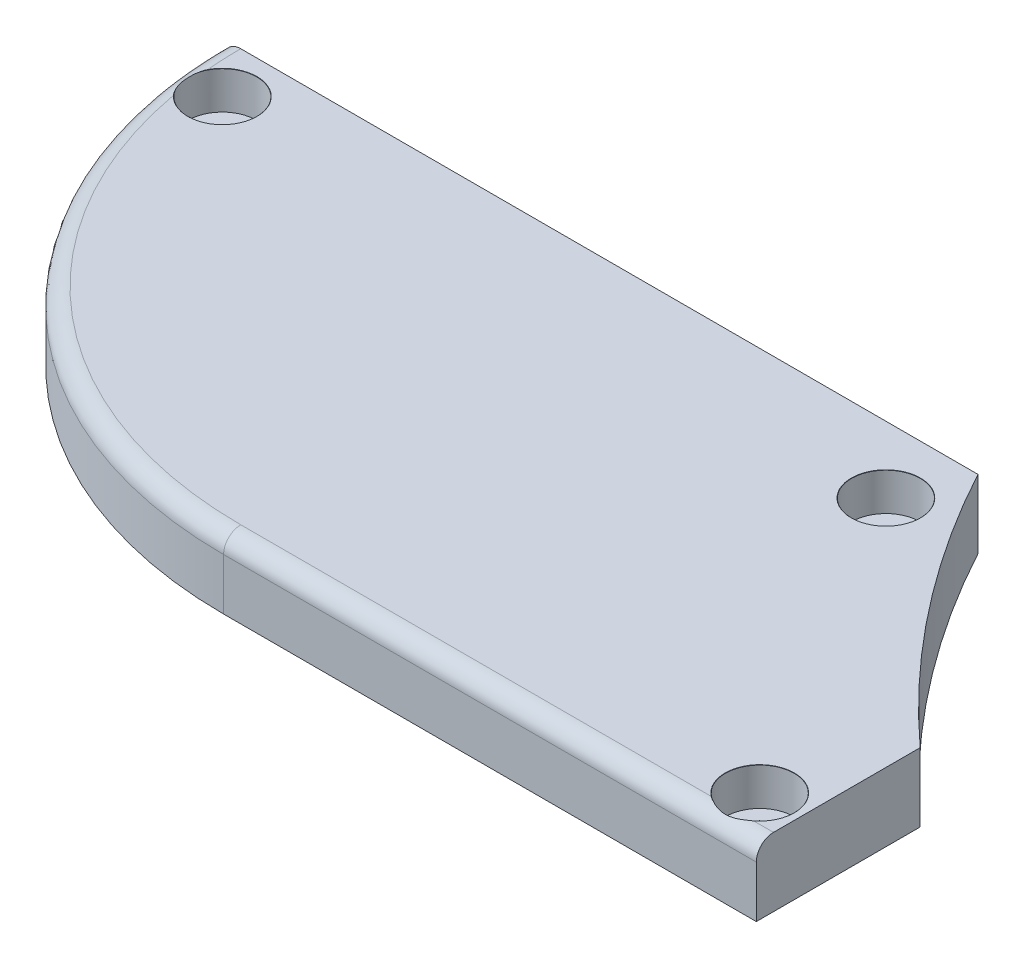
ISO-10303-21;
HEADER;
FILE_DESCRIPTION(('STEP AP214'),'2;1');
FILE_NAME('part.step','',(''),(''),'','','');
FILE_SCHEMA(('AUTOMOTIVE_DESIGN { 1 0 10303 214 1 1 1 1 }'));
ENDSEC;
DATA;
#1=APPLICATION_CONTEXT('core data for automotive mechanical design processes');
#2=APPLICATION_PROTOCOL_DEFINITION('international standard','automotive_design',2000,#1);
#3=PRODUCT_CONTEXT('',#1,'mechanical');
#4=PRODUCT('Part','Part','',(#3));
#5=PRODUCT_RELATED_PRODUCT_CATEGORY('part','',(#4));
#6=PRODUCT_DEFINITION_FORMATION('','',#4);
#7=PRODUCT_DEFINITION_CONTEXT('part definition',#1,'design');
#8=PRODUCT_DEFINITION('design','',#6,#7);
#9=PRODUCT_DEFINITION_SHAPE('','',#8);
#10=(LENGTH_UNIT() NAMED_UNIT(*) SI_UNIT(.MILLI.,.METRE.));
#11=(NAMED_UNIT(*) PLANE_ANGLE_UNIT() SI_UNIT($,.RADIAN.));
#12=(NAMED_UNIT(*) SI_UNIT($,.STERADIAN.) SOLID_ANGLE_UNIT());
#13=UNCERTAINTY_MEASURE_WITH_UNIT(LENGTH_MEASURE(1.E-05),#10,'distance_accuracy_value','');
#14=(GEOMETRIC_REPRESENTATION_CONTEXT(3) GLOBAL_UNCERTAINTY_ASSIGNED_CONTEXT((#13)) GLOBAL_UNIT_ASSIGNED_CONTEXT((#10,
#11,#12)) REPRESENTATION_CONTEXT('',''));
#15=CARTESIAN_POINT('',(0.,0.,0.));
#16=DIRECTION('',(0.,0.,1.));
#17=DIRECTION('',(1.,0.,0.));
#18=AXIS2_PLACEMENT_3D('',#15,#16,#17);
#19=CARTESIAN_POINT('',(-49.2414893279521,8.,-24.8645107517765));
#20=DIRECTION('',(0.,0.,1.));
#21=DIRECTION('',(1.,0.,0.));
#22=AXIS2_PLACEMENT_3D('',#19,#20,#21);
#23=PLANE('',#22);
#24=DIRECTION('',(0.,-1.,0.));
#25=VECTOR('',#24,1.);
#26=CARTESIAN_POINT('',(-56.5540281448018,8.,-24.8645107517765));
#27=LINE('',#26,#25);
#28=CARTESIAN_POINT('',(-56.5540281448018,6.,-24.8645107517765));
#29=VERTEX_POINT('',#28);
#30=CARTESIAN_POINT('',(-56.5540281448018,0.,-24.8645107517765));
#31=VERTEX_POINT('',#30);
#32=EDGE_CURVE('E162',#29,#31,#27,.T.);
#33=ORIENTED_EDGE('',*,*,#32,.F.);
#34=CARTESIAN_POINT('',(-54.5540281448018,6.,-24.8645107517765));
#35=DIRECTION('',(0.,0.,1.));
#36=DIRECTION('',(1.,0.,0.));
#37=AXIS2_PLACEMENT_3D('',#34,#35,#36);
#38=CIRCLE('',#37,2.);
#39=CARTESIAN_POINT('',(-54.5540281448018,8.,-24.8645107517765));
#40=VERTEX_POINT('',#39);
#41=EDGE_CURVE('E11',#29,#40,#38,.F.);
#42=ORIENTED_EDGE('',*,*,#41,.T.);
#43=DIRECTION('',(-1.,0.,0.));
#44=VECTOR('',#43,1.);
#45=CARTESIAN_POINT('',(31.2806646320499,8.,-24.8645107517765));
#46=LINE('',#45,#44);
#47=CARTESIAN_POINT('',(31.2806646320499,8.,-24.8645107517765));
#48=VERTEX_POINT('',#47);
#49=EDGE_CURVE('E126',#48,#40,#46,.T.);
#50=ORIENTED_EDGE('',*,*,#49,.F.);
#51=DIRECTION('',(0.,-1.,0.));
#52=VECTOR('',#51,1.);
#53=CARTESIAN_POINT('',(31.2806646320499,8.,-24.8645107517765));
#54=LINE('',#53,#52);
#55=CARTESIAN_POINT('',(31.2806646320499,0.,-24.8645107517765));
#56=VERTEX_POINT('',#55);
#57=EDGE_CURVE('E137',#48,#56,#54,.T.);
#58=ORIENTED_EDGE('',*,*,#57,.T.);
#59=DIRECTION('',(-1.,0.,0.));
#60=VECTOR('',#59,1.);
#61=CARTESIAN_POINT('',(-49.2414893279521,0.,-24.8645107517765));
#62=LINE('',#61,#60);
#63=EDGE_CURVE('E146',#56,#31,#62,.T.);
#64=ORIENTED_EDGE('',*,*,#63,.T.);
#65=EDGE_LOOP('',(#33,#42,#50,#58,#64));
#66=FACE_BOUND('',#65,.T.);
#67=ADVANCED_FACE('F33',(#66),#23,.F.);
#68=CARTESIAN_POINT('',(-6.55402814480177,8.,-24.8645107517765));
#69=DIRECTION('',(0.,-1.,0.));
#70=DIRECTION('',(0.,0.,-1.));
#71=AXIS2_PLACEMENT_3D('',#68,#69,#70);
#72=CYLINDRICAL_SURFACE('',#71,50.);
#73=DIRECTION('',(0.,-1.,0.));
#74=VECTOR('',#73,1.);
#75=CARTESIAN_POINT('',(-6.55402814480177,8.,25.1354892482235));
#76=LINE('',#75,#74);
#77=CARTESIAN_POINT('',(-6.55402814480177,6.,25.1354892482235));
#78=VERTEX_POINT('',#77);
#79=CARTESIAN_POINT('',(-6.55402814480177,0.,25.1354892482235));
#80=VERTEX_POINT('',#79);
#81=EDGE_CURVE('E160',#78,#80,#76,.T.);
#82=ORIENTED_EDGE('',*,*,#81,.F.);
#83=CARTESIAN_POINT('',(-6.55402814480177,6.,-24.8645107517765));
#84=DIRECTION('',(0.,1.,0.));
#85=DIRECTION('',(0.,0.,1.));
#86=AXIS2_PLACEMENT_3D('',#83,#84,#85);
#87=CIRCLE('',#86,50.);
#88=EDGE_CURVE('E43',#78,#29,#87,.F.);
#89=ORIENTED_EDGE('',*,*,#88,.T.);
#90=ORIENTED_EDGE('',*,*,#32,.T.);
#91=CARTESIAN_POINT('',(-6.55402814480177,0.,-24.8645107517765));
#92=DIRECTION('',(0.,1.,0.));
#93=DIRECTION('',(0.,0.,1.));
#94=AXIS2_PLACEMENT_3D('',#91,#92,#93);
#95=CIRCLE('',#94,50.);
#96=EDGE_CURVE('E149',#31,#80,#95,.T.);
#97=ORIENTED_EDGE('',*,*,#96,.T.);
#98=EDGE_LOOP('',(#82,#89,#90,#97));
#99=FACE_BOUND('',#98,.T.);
#100=ADVANCED_FACE('F281',(#99),#72,.T.);
#101=CARTESIAN_POINT('',(-6.55402814480169,8.,25.1354892482235));
#102=DIRECTION('',(0.,0.,-1.));
#103=DIRECTION('',(-1.,0.,0.));
#104=AXIS2_PLACEMENT_3D('',#101,#102,#103);
#105=PLANE('',#104);
#106=DIRECTION('',(0.,-1.,0.));
#107=VECTOR('',#106,1.);
#108=CARTESIAN_POINT('',(55.4701141591386,8.,25.1354892482235));
#109=LINE('',#108,#107);
#110=CARTESIAN_POINT('',(55.4701141591386,6.,25.1354892482235));
#111=VERTEX_POINT('',#110);
#112=CARTESIAN_POINT('',(55.4701141591386,0.,25.1354892482235));
#113=VERTEX_POINT('',#112);
#114=EDGE_CURVE('E136',#111,#113,#109,.T.);
#115=ORIENTED_EDGE('',*,*,#114,.F.);
#116=DIRECTION('',(1.,0.,0.));
#117=VECTOR('',#116,1.);
#118=CARTESIAN_POINT('',(-6.55402814480177,6.,25.1354892482235));
#119=LINE('',#118,#117);
#120=EDGE_CURVE('E225',#111,#78,#119,.F.);
#121=ORIENTED_EDGE('',*,*,#120,.T.);
#122=ORIENTED_EDGE('',*,*,#81,.T.);
#123=DIRECTION('',(1.,0.,0.));
#124=VECTOR('',#123,1.);
#125=CARTESIAN_POINT('',(-6.55402814480169,0.,25.1354892482235));
#126=LINE('',#125,#124);
#127=EDGE_CURVE('E153',#80,#113,#126,.T.);
#128=ORIENTED_EDGE('',*,*,#127,.T.);
#129=EDGE_LOOP('',(#115,#121,#122,#128));
#130=FACE_BOUND('',#129,.T.);
#131=ADVANCED_FACE('F287',(#130),#105,.F.);
#132=CARTESIAN_POINT('',(55.4701141591386,8.,25.1354892482235));
#133=DIRECTION('',(-1.,0.,0.));
#134=DIRECTION('',(0.,0.,1.));
#135=AXIS2_PLACEMENT_3D('',#132,#133,#134);
#136=PLANE('',#135);
#137=DIRECTION('',(0.,0.,-1.));
#138=VECTOR('',#137,1.);
#139=CARTESIAN_POINT('',(55.4701141591386,8.,25.1354892482235));
#140=LINE('',#139,#138);
#141=CARTESIAN_POINT('',(55.4701141591386,8.,23.1354892482235));
#142=VERTEX_POINT('',#141);
#143=CARTESIAN_POINT('',(55.4701141591386,8.,6.05705590388985));
#144=VERTEX_POINT('',#143);
#145=EDGE_CURVE('E115',#142,#144,#140,.T.);
#146=ORIENTED_EDGE('',*,*,#145,.F.);
#147=CARTESIAN_POINT('',(55.4701141591386,6.,23.1354892482235));
#148=DIRECTION('',(-1.,0.,0.));
#149=DIRECTION('',(0.,0.,1.));
#150=AXIS2_PLACEMENT_3D('',#147,#148,#149);
#151=CIRCLE('',#150,2.);
#152=EDGE_CURVE('E223',#142,#111,#151,.F.);
#153=ORIENTED_EDGE('',*,*,#152,.T.);
#154=ORIENTED_EDGE('',*,*,#114,.T.);
#155=DIRECTION('',(0.,0.,-1.));
#156=VECTOR('',#155,1.);
#157=CARTESIAN_POINT('',(55.4701141591386,0.,25.1354892482235));
#158=LINE('',#157,#156);
#159=CARTESIAN_POINT('',(55.4701141591386,0.,6.05705590388985));
#160=VERTEX_POINT('',#159);
#161=EDGE_CURVE('E132',#113,#160,#158,.T.);
#162=ORIENTED_EDGE('',*,*,#161,.T.);
#163=DIRECTION('',(0.,-1.,0.));
#164=VECTOR('',#163,1.);
#165=CARTESIAN_POINT('',(55.4701141591386,8.,6.05705590388985));
#166=LINE('',#165,#164);
#167=EDGE_CURVE('E129',#144,#160,#166,.T.);
#168=ORIENTED_EDGE('',*,*,#167,.F.);
#169=EDGE_LOOP('',(#146,#153,#154,#162,#168));
#170=FACE_BOUND('',#169,.T.);
#171=ADVANCED_FACE('F130',(#170),#136,.F.);
#172=CARTESIAN_POINT('',(133.445971855199,8.,-79.8645107517775));
#173=DIRECTION('',(0.,-1.,0.));
#174=DIRECTION('',(0.,0.,-1.));
#175=AXIS2_PLACEMENT_3D('',#172,#173,#174);
#176=CYLINDRICAL_SURFACE('',#175,116.029091179758);
#177=CARTESIAN_POINT('',(133.445971855199,0.,-79.8645107517775));
#178=DIRECTION('',(0.,1.,0.));
#179=DIRECTION('',(0.,0.,1.));
#180=AXIS2_PLACEMENT_3D('',#177,#178,#179);
#181=CIRCLE('',#180,116.029091179758);
#182=EDGE_CURVE('E157',#56,#160,#181,.T.);
#183=ORIENTED_EDGE('',*,*,#182,.F.);
#184=ORIENTED_EDGE('',*,*,#57,.F.);
#185=CARTESIAN_POINT('',(133.445971855199,8.,-79.8645107517775));
#186=DIRECTION('',(0.,1.,0.));
#187=DIRECTION('',(0.,0.,1.));
#188=AXIS2_PLACEMENT_3D('',#185,#186,#187);
#189=CIRCLE('',#188,116.029091179758);
#190=EDGE_CURVE('E121',#48,#144,#189,.T.);
#191=ORIENTED_EDGE('',*,*,#190,.T.);
#192=ORIENTED_EDGE('',*,*,#167,.T.);
#193=EDGE_LOOP('',(#183,#184,#191,#192));
#194=FACE_BOUND('',#193,.T.);
#195=ADVANCED_FACE('F139',(#194),#176,.F.);
#196=CARTESIAN_POINT('',(-6.55402814480177,8.,-24.8645107517765));
#197=DIRECTION('',(0.,1.,0.));
#198=DIRECTION('',(0.,0.,1.));
#199=AXIS2_PLACEMENT_3D('',#196,#197,#198);
#200=PLANE('',#199);
#201=CARTESIAN_POINT('',(28.2999106577228,8.,-17.122913844562));
#202=DIRECTION('',(0.,1.,0.));
#203=DIRECTION('',(0.,0.,1.));
#204=AXIS2_PLACEMENT_3D('',#201,#202,#203);
#205=CIRCLE('',#204,4.025);
#206=CARTESIAN_POINT('',(28.2999106577228,8.,-13.097913844562));
#207=VERTEX_POINT('',#206);
#208=EDGE_CURVE('E291',#207,#207,#205,.T.);
#209=ORIENTED_EDGE('',*,*,#208,.F.);
#210=EDGE_LOOP('',(#209));
#211=FACE_BOUND('',#210,.T.);
#212=CARTESIAN_POINT('',(50.6890364189282,8.,19.9544099619929));
#213=DIRECTION('',(0.,1.,0.));
#214=DIRECTION('',(0.,0.,1.));
#215=AXIS2_PLACEMENT_3D('',#212,#213,#214);
#216=CIRCLE('',#215,4.025);
#217=CARTESIAN_POINT('',(53.1550776948834,8.,23.1354892482235));
#218=VERTEX_POINT('',#217);
#219=CARTESIAN_POINT('',(48.2229951429731,8.,23.1354892482235));
#220=VERTEX_POINT('',#219);
#221=EDGE_CURVE('E176',#218,#220,#216,.T.);
#222=ORIENTED_EDGE('',*,*,#221,.F.);
#223=DIRECTION('',(1.,0.,0.));
#224=VECTOR('',#223,1.);
#225=CARTESIAN_POINT('',(-6.55402814480177,8.,23.1354892482235));
#226=LINE('',#225,#224);
#227=EDGE_CURVE('E123',#218,#142,#226,.T.);
#228=ORIENTED_EDGE('',*,*,#227,.T.);
#229=ORIENTED_EDGE('',*,*,#145,.T.);
#230=ORIENTED_EDGE('',*,*,#190,.F.);
#231=ORIENTED_EDGE('',*,*,#49,.T.);
#232=CARTESIAN_POINT('',(-6.55402814480177,8.,-24.8645107517765));
#233=DIRECTION('',(0.,1.,0.));
#234=DIRECTION('',(0.,0.,1.));
#235=AXIS2_PLACEMENT_3D('',#232,#233,#234);
#236=CIRCLE('',#235,48.);
#237=CARTESIAN_POINT('',(-54.3839185638535,8.,-20.8269889250235));
#238=VERTEX_POINT('',#237);
#239=EDGE_CURVE('E182',#40,#238,#236,.T.);
#240=ORIENTED_EDGE('',*,*,#239,.T.);
#241=CARTESIAN_POINT('',(-50.8095606092092,8.,-18.9764240890691));
#242=DIRECTION('',(0.,1.,0.));
#243=DIRECTION('',(0.,0.,1.));
#244=AXIS2_PLACEMENT_3D('',#241,#242,#243);
#245=CIRCLE('',#244,4.025);
#246=CARTESIAN_POINT('',(-53.775714897599,8.,-16.2556606415296));
#247=VERTEX_POINT('',#246);
#248=EDGE_CURVE('E171',#247,#238,#245,.T.);
#249=ORIENTED_EDGE('',*,*,#248,.F.);
#250=CARTESIAN_POINT('',(-6.55402814480177,8.,-24.8645107517765));
#251=DIRECTION('',(0.,1.,0.));
#252=DIRECTION('',(0.,0.,1.));
#253=AXIS2_PLACEMENT_3D('',#250,#251,#252);
#254=CIRCLE('',#253,48.);
#255=CARTESIAN_POINT('',(-6.55402814480177,8.,23.1354892482235));
#256=VERTEX_POINT('',#255);
#257=EDGE_CURVE('E164',#247,#256,#254,.T.);
#258=ORIENTED_EDGE('',*,*,#257,.T.);
#259=DIRECTION('',(1.,0.,0.));
#260=VECTOR('',#259,1.);
#261=CARTESIAN_POINT('',(-6.55402814480177,8.,23.1354892482235));
#262=LINE('',#261,#260);
#263=EDGE_CURVE('E179',#256,#220,#262,.T.);
#264=ORIENTED_EDGE('',*,*,#263,.T.);
#265=EDGE_LOOP('',(#222,#228,#229,#230,#231,#240,#249,#258,#264));
#266=FACE_BOUND('',#265,.T.);
#267=ADVANCED_FACE('F118',(#211,#266),#200,.T.);
#268=CARTESIAN_POINT('',(-6.55402814480177,0.,-24.8645107517765));
#269=DIRECTION('',(0.,1.,0.));
#270=DIRECTION('',(0.,0.,1.));
#271=AXIS2_PLACEMENT_3D('',#268,#269,#270);
#272=PLANE('',#271);
#273=CARTESIAN_POINT('',(28.2999106577228,0.,-17.122913844562));
#274=DIRECTION('',(0.,1.,0.));
#275=DIRECTION('',(0.,0.,1.));
#276=AXIS2_PLACEMENT_3D('',#273,#274,#275);
#277=CIRCLE('',#276,2.25);
#278=CARTESIAN_POINT('',(28.2999106577228,0.,-14.8729138445621));
#279=VERTEX_POINT('',#278);
#280=EDGE_CURVE('E173',#279,#279,#277,.T.);
#281=ORIENTED_EDGE('',*,*,#280,.T.);
#282=EDGE_LOOP('',(#281));
#283=FACE_BOUND('',#282,.T.);
#284=CARTESIAN_POINT('',(50.6890364189282,0.,19.9544099619929));
#285=DIRECTION('',(0.,1.,0.));
#286=DIRECTION('',(0.,0.,1.));
#287=AXIS2_PLACEMENT_3D('',#284,#285,#286);
#288=CIRCLE('',#287,2.25);
#289=CARTESIAN_POINT('',(50.6890364189282,0.,22.2044099619929));
#290=VERTEX_POINT('',#289);
#291=EDGE_CURVE('E168',#290,#290,#288,.T.);
#292=ORIENTED_EDGE('',*,*,#291,.T.);
#293=EDGE_LOOP('',(#292));
#294=FACE_BOUND('',#293,.T.);
#295=CARTESIAN_POINT('',(-50.8095606092092,0.,-18.9764240890691));
#296=DIRECTION('',(0.,1.,0.));
#297=DIRECTION('',(0.,0.,1.));
#298=AXIS2_PLACEMENT_3D('',#295,#296,#297);
#299=CIRCLE('',#298,2.25);
#300=CARTESIAN_POINT('',(-50.8095606092092,0.,-16.7264240890691));
#301=VERTEX_POINT('',#300);
#302=EDGE_CURVE('E150',#301,#301,#299,.T.);
#303=ORIENTED_EDGE('',*,*,#302,.T.);
#304=EDGE_LOOP('',(#303));
#305=FACE_BOUND('',#304,.T.);
#306=ORIENTED_EDGE('',*,*,#63,.F.);
#307=ORIENTED_EDGE('',*,*,#182,.T.);
#308=ORIENTED_EDGE('',*,*,#161,.F.);
#309=ORIENTED_EDGE('',*,*,#127,.F.);
#310=ORIENTED_EDGE('',*,*,#96,.F.);
#311=EDGE_LOOP('',(#306,#307,#308,#309,#310));
#312=FACE_BOUND('',#311,.T.);
#313=ADVANCED_FACE('F284',(#283,#294,#305,#312),#272,.F.);
#314=CARTESIAN_POINT('',(-50.8095606092092,8.,-18.9764240890691));
#315=DIRECTION('',(0.,1.,0.));
#316=DIRECTION('',(0.,0.,1.));
#317=AXIS2_PLACEMENT_3D('',#314,#315,#316);
#318=CYLINDRICAL_SURFACE('',#317,2.25);
#319=CARTESIAN_POINT('',(-50.8095606092092,3.6,-18.9764240890691));
#320=DIRECTION('',(0.,1.,0.));
#321=DIRECTION('',(0.,0.,1.));
#322=AXIS2_PLACEMENT_3D('',#319,#320,#321);
#323=CIRCLE('',#322,2.25);
#324=CARTESIAN_POINT('',(-50.8095606092092,3.6,-16.7264240890691));
#325=VERTEX_POINT('',#324);
#326=EDGE_CURVE('E167',#325,#325,#323,.T.);
#327=ORIENTED_EDGE('',*,*,#326,.T.);
#328=EDGE_LOOP('',(#327));
#329=FACE_BOUND('',#328,.T.);
#330=ORIENTED_EDGE('',*,*,#302,.F.);
#331=EDGE_LOOP('',(#330));
#332=FACE_BOUND('',#331,.T.);
#333=ADVANCED_FACE('F336',(#329,#332),#318,.F.);
#334=CARTESIAN_POINT('',(-48.5595606092092,3.6,-18.9764240890691));
#335=DIRECTION('',(0.,-1.,0.));
#336=DIRECTION('',(0.,0.,-1.));
#337=AXIS2_PLACEMENT_3D('',#334,#335,#336);
#338=PLANE('',#337);
#339=ORIENTED_EDGE('',*,*,#326,.F.);
#340=EDGE_LOOP('',(#339));
#341=FACE_BOUND('',#340,.T.);
#342=CARTESIAN_POINT('',(-50.8095606092092,3.6,-18.9764240890691));
#343=DIRECTION('',(0.,1.,0.));
#344=DIRECTION('',(0.,0.,1.));
#345=AXIS2_PLACEMENT_3D('',#342,#343,#344);
#346=CIRCLE('',#345,4.);
#347=CARTESIAN_POINT('',(-50.8095606092092,3.6,-14.9764240890691));
#348=VERTEX_POINT('',#347);
#349=EDGE_CURVE('E266',#348,#348,#346,.T.);
#350=ORIENTED_EDGE('',*,*,#349,.T.);
#351=EDGE_LOOP('',(#350));
#352=FACE_BOUND('',#351,.T.);
#353=ADVANCED_FACE('F251',(#341,#352),#338,.F.);
#354=CARTESIAN_POINT('',(-50.8095606092092,8.,-18.9764240890691));
#355=DIRECTION('',(0.,1.,0.));
#356=DIRECTION('',(0.,0.,1.));
#357=AXIS2_PLACEMENT_3D('',#354,#355,#356);
#358=CYLINDRICAL_SURFACE('',#357,4.);
#359=ORIENTED_EDGE('',*,*,#349,.F.);
#360=EDGE_LOOP('',(#359));
#361=FACE_BOUND('',#360,.T.);
#362=CARTESIAN_POINT('',(-50.8095606092092,7.975,-18.9764240890691));
#363=DIRECTION('',(0.,1.,0.));
#364=DIRECTION('',(0.,0.,1.));
#365=AXIS2_PLACEMENT_3D('',#362,#363,#364);
#366=CIRCLE('',#365,4.);
#367=CARTESIAN_POINT('',(-54.2007807698612,7.975,-16.8551919419463));
#368=VERTEX_POINT('',#367);
#369=CARTESIAN_POINT('',(-54.6374400871047,7.975,-20.1371732879513));
#370=VERTEX_POINT('',#369);
#371=EDGE_CURVE('E261',#368,#370,#366,.T.);
#372=ORIENTED_EDGE('',*,*,#371,.T.);
#373=CARTESIAN_POINT('',(-54.6374400871047,7.97500000000151,-20.1371732879513));
#374=CARTESIAN_POINT('',(-54.6700852374707,7.96809439862302,-20.0295401907159));
#375=CARTESIAN_POINT('',(-54.6981638133698,7.96047464076589,-19.9205733962631));
#376=CARTESIAN_POINT('',(-54.7450576324901,7.94510195002628,-19.700643933049));
#377=CARTESIAN_POINT('',(-54.7638705006537,7.93734898352522,-19.5896807601079));
#378=CARTESIAN_POINT('',(-54.792038794168,7.92303379685063,-19.3668581841801));
#379=CARTESIAN_POINT('',(-54.8014255575148,7.91646769095477,-19.255003005447));
#380=CARTESIAN_POINT('',(-54.8107637295081,7.9054539630977,-19.0308059087546));
#381=CARTESIAN_POINT('',(-54.8107164934099,7.90100603693824,-18.918464063027));
#382=CARTESIAN_POINT('',(-54.8011756501168,7.89487430996729,-18.6943649835985));
#383=CARTESIAN_POINT('',(-54.79170403592,7.89318409791611,-18.5826069977566));
#384=CARTESIAN_POINT('',(-54.7634086519113,7.89278538211182,-18.3602711821109));
#385=CARTESIAN_POINT('',(-54.7445845267173,7.89407699167049,-18.2496933973162));
#386=CARTESIAN_POINT('',(-54.6977281808207,7.89946135726297,-18.0305296202736));
#387=CARTESIAN_POINT('',(-54.6696919825783,7.90355532411228,-17.9219445098333));
#388=CARTESIAN_POINT('',(-54.6046431745449,7.91396322692434,-17.7076086907514));
#389=CARTESIAN_POINT('',(-54.5676303616702,7.92027721311348,-17.6018580462958));
#390=CARTESIAN_POINT('',(-54.4862188366689,7.93398025155805,-17.3972074087937));
#391=CARTESIAN_POINT('',(-54.4420914333539,7.94132888208628,-17.2981965181331));
#392=CARTESIAN_POINT('',(-54.3459610757329,7.95615358322069,-17.1040990059096));
#393=CARTESIAN_POINT('',(-54.293958959337,7.96362964019301,-17.0090119681966));
#394=CARTESIAN_POINT('',(-54.1823337825086,7.97744414615561,-16.8232538852916));
#395=CARTESIAN_POINT('',(-54.1227067058792,7.98378199136972,-16.732585202333));
#396=CARTESIAN_POINT('',(-53.9961902944901,7.99381971079954,-16.5562609600694));
#397=CARTESIAN_POINT('',(-53.9292979554548,7.99751848890641,-16.4706074973255));
#398=CARTESIAN_POINT('',(-53.8589665657087,7.99914641808363,-16.3877712903212));
#399=B_SPLINE_CURVE_WITH_KNOTS('',3,(#373,#374,#375,#376,#377,#378,#379,#380,#381,#382,#383,
#384,#385,#386,#387,#388,#389,#390,#391,#392,#393,#394,#395,#396,#397,#398),.UNSPECIFIED.,.F.,
.F.,(4,2,2,2,2,2,2,2,2,2,2,2,4),(0.,0.337953785238733,0.675994152369019,1.01290691342684,
1.34977127481559,1.68585135926872,2.02194421526225,2.35818237875282,2.69442814988703,
3.02001555196558,3.34556833417615,3.67129330238746,3.99715347841884),.UNSPECIFIED.);
#400=EDGE_CURVE('E56',#370,#368,#399,.T.);
#401=ORIENTED_EDGE('',*,*,#400,.T.);
#402=EDGE_LOOP('',(#372,#401));
#403=FACE_BOUND('',#402,.T.);
#404=ADVANCED_FACE('F245',(#361,#403),#358,.F.);
#405=CARTESIAN_POINT('',(-50.8095606092092,8.,-18.9764240890691));
#406=DIRECTION('',(0.,1.,0.));
#407=DIRECTION('',(0.,0.,1.));
#408=AXIS2_PLACEMENT_3D('',#405,#406,#407);
#409=CONICAL_SURFACE('',#408,4.025,0.785398163397483);
#410=ORIENTED_EDGE('',*,*,#248,.T.);
#411=CARTESIAN_POINT('',(-54.3839185638535,8.,-20.8269889250235));
#412=CARTESIAN_POINT('',(-54.4035058006577,7.99999613392668,-20.7891483942682));
#413=CARTESIAN_POINT('',(-54.4221490849165,7.99961375434979,-20.7508350923682));
#414=CARTESIAN_POINT('',(-54.4576382528048,7.99823635629777,-20.6734132223225));
#415=CARTESIAN_POINT('',(-54.4744848749823,7.99724159070184,-20.6343049888791));
#416=CARTESIAN_POINT('',(-54.5222947808201,7.99356942778783,-20.516442947286));
#417=CARTESIAN_POINT('',(-54.5507625240542,7.99020059635411,-20.4366907960322));
#418=CARTESIAN_POINT('',(-54.6016265051915,7.98248305584431,-20.2753835547812));
#419=CARTESIAN_POINT('',(-54.6240243566774,7.97813460774746,-20.1938289501844));
#420=CARTESIAN_POINT('',(-54.6633597542301,7.96903127070152,-20.028910540388));
#421=CARTESIAN_POINT('',(-54.6802638071022,7.96427410428762,-19.9455388268321));
#422=CARTESIAN_POINT('',(-54.6945917897403,7.95963101057347,-19.8617584986141));
#423=B_SPLINE_CURVE_WITH_KNOTS('',3,(#411,#412,#413,#414,#415,#416,#417,#418,#419,#420,#421,
#422),.UNSPECIFIED.,.F.,.F.,(4,2,2,2,2,4),(0.,0.127790955811947,0.255529176884876,
0.509459919054435,0.763323091479887,1.01870612117614),.UNSPECIFIED.);
#424=EDGE_CURVE('E234',#238,#370,#423,.T.);
#425=ORIENTED_EDGE('',*,*,#424,.T.);
#426=ORIENTED_EDGE('',*,*,#371,.F.);
#427=CARTESIAN_POINT('',(-54.2007807698611,7.97499999999985,-16.8551919419463));
#428=CARTESIAN_POINT('',(-54.159498741522,7.97948381135721,-16.7807314885709));
#429=CARTESIAN_POINT('',(-54.1156741928688,7.9838295748031,-16.7075964411517));
#430=CARTESIAN_POINT('',(-54.0229080418242,7.99136263990265,-16.5654719653308));
#431=CARTESIAN_POINT('',(-53.9740122305053,7.99455931322166,-16.4964530161107));
#432=CARTESIAN_POINT('',(-53.8703668278059,7.9990161263812,-16.3627451275816));
#433=CARTESIAN_POINT('',(-53.815613999612,8.00027518944846,-16.2980586149874));
#434=CARTESIAN_POINT('',(-53.7285932505008,7.99978560793228,-16.2051481774442));
#435=CARTESIAN_POINT('',(-53.6986345507084,7.99921857575995,-16.1747454706147));
#436=CARTESIAN_POINT('',(-53.6370728606868,7.99707057811333,-16.1156463986394));
#437=CARTESIAN_POINT('',(-53.6054686263173,7.99548883490946,-16.0869513607944));
#438=CARTESIAN_POINT('',(-53.5730298284707,7.99329587931538,-16.0592440041383));
#439=B_SPLINE_CURVE_WITH_KNOTS('',3,(#427,#428,#429,#430,#431,#432,#433,#434,#435,#436,#437,
#438),.UNSPECIFIED.,.F.,.F.,(4,2,2,2,2,4),(0.,0.255815129474094,0.509493847624078,
0.763313489861028,0.891305098052223,1.01939492334871),.UNSPECIFIED.);
#440=EDGE_CURVE('E227',#368,#247,#439,.T.);
#441=ORIENTED_EDGE('',*,*,#440,.T.);
#442=EDGE_LOOP('',(#410,#425,#426,#441));
#443=FACE_BOUND('',#442,.T.);
#444=ADVANCED_FACE('F240',(#443),#409,.F.);
#445=CARTESIAN_POINT('',(50.6890364189282,8.,19.9544099619929));
#446=DIRECTION('',(0.,1.,0.));
#447=DIRECTION('',(0.,0.,1.));
#448=AXIS2_PLACEMENT_3D('',#445,#446,#447);
#449=CYLINDRICAL_SURFACE('',#448,2.25);
#450=CARTESIAN_POINT('',(50.6890364189282,3.6,19.9544099619929));
#451=DIRECTION('',(0.,1.,0.));
#452=DIRECTION('',(0.,0.,1.));
#453=AXIS2_PLACEMENT_3D('',#450,#451,#452);
#454=CIRCLE('',#453,2.25);
#455=CARTESIAN_POINT('',(50.6890364189282,3.6,22.2044099619929));
#456=VERTEX_POINT('',#455);
#457=EDGE_CURVE('E172',#456,#456,#454,.T.);
#458=ORIENTED_EDGE('',*,*,#457,.T.);
#459=EDGE_LOOP('',(#458));
#460=FACE_BOUND('',#459,.T.);
#461=ORIENTED_EDGE('',*,*,#291,.F.);
#462=EDGE_LOOP('',(#461));
#463=FACE_BOUND('',#462,.T.);
#464=ADVANCED_FACE('F244',(#460,#463),#449,.F.);
#465=CARTESIAN_POINT('',(52.9390364189282,3.6,19.9544099619929));
#466=DIRECTION('',(0.,-1.,0.));
#467=DIRECTION('',(0.,0.,-1.));
#468=AXIS2_PLACEMENT_3D('',#465,#466,#467);
#469=PLANE('',#468);
#470=ORIENTED_EDGE('',*,*,#457,.F.);
#471=EDGE_LOOP('',(#470));
#472=FACE_BOUND('',#471,.T.);
#473=CARTESIAN_POINT('',(50.6890364189282,3.6,19.9544099619929));
#474=DIRECTION('',(0.,1.,0.));
#475=DIRECTION('',(0.,0.,1.));
#476=AXIS2_PLACEMENT_3D('',#473,#474,#475);
#477=CIRCLE('',#476,4.);
#478=CARTESIAN_POINT('',(50.6890364189282,3.6,23.9544099619929));
#479=VERTEX_POINT('',#478);
#480=EDGE_CURVE('E309',#479,#479,#477,.T.);
#481=ORIENTED_EDGE('',*,*,#480,.T.);
#482=EDGE_LOOP('',(#481));
#483=FACE_BOUND('',#482,.T.);
#484=ADVANCED_FACE('F214',(#472,#483),#469,.F.);
#485=CARTESIAN_POINT('',(50.6890364189282,8.,19.9544099619929));
#486=DIRECTION('',(0.,1.,0.));
#487=DIRECTION('',(0.,0.,1.));
#488=AXIS2_PLACEMENT_3D('',#485,#486,#487);
#489=CYLINDRICAL_SURFACE('',#488,4.);
#490=ORIENTED_EDGE('',*,*,#480,.F.);
#491=EDGE_LOOP('',(#490));
#492=FACE_BOUND('',#491,.T.);
#493=CARTESIAN_POINT('',(50.6890364189282,7.975,19.9544099619929));
#494=DIRECTION('',(0.,1.,0.));
#495=DIRECTION('',(0.,0.,1.));
#496=AXIS2_PLACEMENT_3D('',#493,#494,#495);
#497=CIRCLE('',#496,4.);
#498=CARTESIAN_POINT('',(52.6321693008443,7.975,23.4507272535465));
#499=VERTEX_POINT('',#498);
#500=CARTESIAN_POINT('',(48.7459035370122,7.975,23.4507272535465));
#501=VERTEX_POINT('',#500);
#502=EDGE_CURVE('E307',#499,#501,#497,.T.);
#503=ORIENTED_EDGE('',*,*,#502,.T.);
#504=CARTESIAN_POINT('',(48.7459035370122,7.975,23.4507272535465));
#505=CARTESIAN_POINT('',(48.8440836258881,7.96625992375167,23.505294058161));
#506=CARTESIAN_POINT('',(48.9444276668713,7.95593350530513,23.5556473621267));
#507=CARTESIAN_POINT('',(49.1488811111442,7.93388184315774,23.6477133335889));
#508=CARTESIAN_POINT('',(49.2529911441561,7.92215636475563,23.6894245480989));
#509=CARTESIAN_POINT('',(49.4645315677869,7.89906810045516,23.7640274448091));
#510=CARTESIAN_POINT('',(49.5719664870538,7.88770585632354,23.7969064492073));
#511=CARTESIAN_POINT('',(49.7893933593413,7.86689832892001,23.8535456483644));
#512=CARTESIAN_POINT('',(49.8993850475576,7.85745284810629,23.8773067830368));
#513=CARTESIAN_POINT('',(50.1214211418529,7.84172638656115,23.9155366874312));
#514=CARTESIAN_POINT('',(50.2334690374823,7.83545142597869,23.9299877935711));
#515=CARTESIAN_POINT('',(50.458543522394,7.82694489932684,23.9493604250193));
#516=CARTESIAN_POINT('',(50.5715700899593,7.82471324376497,23.9542821612461));
#517=CARTESIAN_POINT('',(50.7974397035654,7.82460070104761,23.9545326313615));
#518=CARTESIAN_POINT('',(50.9102827287928,7.82671229314201,23.9498779477366));
#519=CARTESIAN_POINT('',(51.1350188350703,7.83498161752093,23.9310687832703));
#520=CARTESIAN_POINT('',(51.2469119228969,7.84113932091733,23.9169143702543));
#521=CARTESIAN_POINT('',(51.4601122587262,7.85605072632032,23.8807563284192));
#522=CARTESIAN_POINT('',(51.5615581029457,7.86456123644388,23.859460214693));
#523=CARTESIAN_POINT('',(51.7623851411305,7.88333976580276,23.8091012233443));
#524=CARTESIAN_POINT('',(51.8617653230366,7.89360862478346,23.780034630987));
#525=CARTESIAN_POINT('',(52.0579060008507,7.91471915191448,23.7143160678101));
#526=CARTESIAN_POINT('',(52.1546667790419,7.92556075796738,23.6776649180588));
#527=CARTESIAN_POINT('',(52.3451259493041,7.94648309564437,23.5969451825252));
#528=CARTESIAN_POINT('',(52.4388246268174,7.95656389830421,23.552877290484));
#529=CARTESIAN_POINT('',(52.6104681747342,7.97330912653122,23.4638490536598));
#530=CARTESIAN_POINT('',(52.6888517032518,7.98024954365544,23.4197857690004));
#531=CARTESIAN_POINT('',(52.8425825734047,7.99142225368343,23.3264012475805));
#532=CARTESIAN_POINT('',(52.9179313940474,7.9956558811179,23.2770826158829));
#533=CARTESIAN_POINT('',(53.0653977897009,8.00032033737746,23.1732672487483));
#534=CARTESIAN_POINT('',(53.1375072186438,8.00074206079261,23.1187584290026));
#535=CARTESIAN_POINT('',(53.277895818641,7.99654733678541,23.0049874487233));
#536=CARTESIAN_POINT('',(53.3461686409693,7.99192278289869,22.9457177821298));
#537=CARTESIAN_POINT('',(53.4122024663441,7.98416568897539,22.8843189500336));
#538=B_SPLINE_CURVE_WITH_KNOTS('',3,(#504,#505,#506,#507,#508,#509,#510,#511,#512,#513,#514,
#515,#516,#517,#518,#519,#520,#521,#522,#523,#524,#525,#526,#527,#528,#529,#530,#531,#532,#533,
#534,#535,#536,#537),.UNSPECIFIED.,.F.,.F.,(4,2,2,2,2,2,2,2,2,2,2,2,2,2,2,2,4),(0.,
0.337841785988341,0.675740326992569,1.01412132862876,1.35246743895941,1.69145360531304,
2.03043226862588,2.3688244520294,2.70721421943118,3.01890175286382,3.33073855810711,
3.64254162301931,3.95431553895058,4.22465203096304,4.49485513576638,4.76570349861804,
5.03698760036024),.UNSPECIFIED.);
#539=EDGE_CURVE('E217',#501,#499,#538,.T.);
#540=ORIENTED_EDGE('',*,*,#539,.T.);
#541=EDGE_LOOP('',(#503,#540));
#542=FACE_BOUND('',#541,.T.);
#543=ADVANCED_FACE('F207',(#492,#542),#489,.F.);
#544=CARTESIAN_POINT('',(50.6890364189282,8.,19.9544099619929));
#545=DIRECTION('',(0.,1.,0.));
#546=DIRECTION('',(0.,0.,1.));
#547=AXIS2_PLACEMENT_3D('',#544,#545,#546);
#548=CONICAL_SURFACE('',#547,4.025,0.785398163397483);
#549=ORIENTED_EDGE('',*,*,#221,.T.);
#550=CARTESIAN_POINT('',(48.2229951429731,8.,23.1354892482235));
#551=CARTESIAN_POINT('',(48.2568403490029,7.99999519453566,23.1617212571462));
#552=CARTESIAN_POINT('',(48.2913991692254,7.99948423637367,23.18700030748));
#553=CARTESIAN_POINT('',(48.3617310197746,7.9976360527402,23.2357325660376));
#554=CARTESIAN_POINT('',(48.3975032948951,7.9962993325868,23.2591868810172));
#555=CARTESIAN_POINT('',(48.5058705613242,7.99135161225349,23.3266588317759));
#556=CARTESIAN_POINT('',(48.5800006697177,7.98679766610228,23.3681539629938));
#557=CARTESIAN_POINT('',(48.731176721329,7.97628711668067,23.4450043909974));
#558=CARTESIAN_POINT('',(48.8082212110627,7.97033120506681,23.480362700474));
#559=CARTESIAN_POINT('',(48.9651403769352,7.95774496517379,23.5457429773535));
#560=CARTESIAN_POINT('',(49.0450311618842,7.95111018325664,23.5757256153141));
#561=CARTESIAN_POINT('',(49.1257354942084,7.94455084863123,23.6031664842398));
#562=B_SPLINE_CURVE_WITH_KNOTS('',3,(#550,#551,#552,#553,#554,#555,#556,#557,#558,#559,#560,
#561),.UNSPECIFIED.,.F.,.F.,(4,2,2,2,2,4),(0.,0.12841150501782,0.256744507432872,
0.511592603535811,0.76631523344237,1.02283151144825),.UNSPECIFIED.);
#563=EDGE_CURVE('E192',#220,#501,#562,.T.);
#564=ORIENTED_EDGE('',*,*,#563,.T.);
#565=ORIENTED_EDGE('',*,*,#502,.F.);
#566=CARTESIAN_POINT('',(52.6321693008443,7.975,23.4507272535465));
#567=CARTESIAN_POINT('',(52.687908892401,7.97916858408933,23.4245193875704));
#568=CARTESIAN_POINT('',(52.7429737733871,7.98307784727856,23.3967666193936));
#569=CARTESIAN_POINT('',(52.8510537846897,7.98993581295576,23.3380678149421));
#570=CARTESIAN_POINT('',(52.9040781719265,7.99288945904835,23.3071393401356));
#571=CARTESIAN_POINT('',(53.0079901027433,7.99744777555319,23.2417037932891));
#572=CARTESIAN_POINT('',(53.0588768871228,7.99905197047316,23.2071954646598));
#573=CARTESIAN_POINT('',(53.1581061501053,8.00032888551221,23.1341574345278));
#574=CARTESIAN_POINT('',(53.2064337293794,7.99999133316942,23.0956074067549));
#575=CARTESIAN_POINT('',(53.2530132211381,7.9983793622784,23.0549912704797));
#576=B_SPLINE_CURVE_WITH_KNOTS('',3,(#566,#567,#568,#569,#570,#571,#572,#573,#574,#575),
.UNSPECIFIED.,.F.,.F.,(4,2,2,2,4),(0.,0.185220872980336,0.369467642251146,0.55377930550508,
0.739066929848988),.UNSPECIFIED.);
#577=EDGE_CURVE('E185',#499,#218,#576,.T.);
#578=ORIENTED_EDGE('',*,*,#577,.T.);
#579=EDGE_LOOP('',(#549,#564,#565,#578));
#580=FACE_BOUND('',#579,.T.);
#581=ADVANCED_FACE('F201',(#580),#548,.F.);
#582=CARTESIAN_POINT('',(28.2999106577228,8.,-17.122913844562));
#583=DIRECTION('',(0.,1.,0.));
#584=DIRECTION('',(0.,0.,1.));
#585=AXIS2_PLACEMENT_3D('',#582,#583,#584);
#586=CYLINDRICAL_SURFACE('',#585,2.25);
#587=CARTESIAN_POINT('',(28.2999106577228,3.6,-17.122913844562));
#588=DIRECTION('',(0.,1.,0.));
#589=DIRECTION('',(0.,0.,1.));
#590=AXIS2_PLACEMENT_3D('',#587,#588,#589);
#591=CIRCLE('',#590,2.25);
#592=CARTESIAN_POINT('',(28.2999106577228,3.6,-14.8729138445621));
#593=VERTEX_POINT('',#592);
#594=EDGE_CURVE('E177',#593,#593,#591,.T.);
#595=ORIENTED_EDGE('',*,*,#594,.T.);
#596=EDGE_LOOP('',(#595));
#597=FACE_BOUND('',#596,.T.);
#598=ORIENTED_EDGE('',*,*,#280,.F.);
#599=EDGE_LOOP('',(#598));
#600=FACE_BOUND('',#599,.T.);
#601=ADVANCED_FACE('F206',(#597,#600),#586,.F.);
#602=CARTESIAN_POINT('',(30.5499106577228,3.6,-17.122913844562));
#603=DIRECTION('',(0.,-1.,0.));
#604=DIRECTION('',(0.,0.,-1.));
#605=AXIS2_PLACEMENT_3D('',#602,#603,#604);
#606=PLANE('',#605);
#607=ORIENTED_EDGE('',*,*,#594,.F.);
#608=EDGE_LOOP('',(#607));
#609=FACE_BOUND('',#608,.T.);
#610=CARTESIAN_POINT('',(28.2999106577228,3.6,-17.122913844562));
#611=DIRECTION('',(0.,1.,0.));
#612=DIRECTION('',(0.,0.,1.));
#613=AXIS2_PLACEMENT_3D('',#610,#611,#612);
#614=CIRCLE('',#613,4.);
#615=CARTESIAN_POINT('',(28.2999106577228,3.6,-13.1229138445621));
#616=VERTEX_POINT('',#615);
#617=EDGE_CURVE('E298',#616,#616,#614,.T.);
#618=ORIENTED_EDGE('',*,*,#617,.T.);
#619=EDGE_LOOP('',(#618));
#620=FACE_BOUND('',#619,.T.);
#621=ADVANCED_FACE('F382',(#609,#620),#606,.F.);
#622=CARTESIAN_POINT('',(28.2999106577228,8.,-17.122913844562));
#623=DIRECTION('',(0.,1.,0.));
#624=DIRECTION('',(0.,0.,1.));
#625=AXIS2_PLACEMENT_3D('',#622,#623,#624);
#626=CYLINDRICAL_SURFACE('',#625,4.);
#627=ORIENTED_EDGE('',*,*,#617,.F.);
#628=EDGE_LOOP('',(#627));
#629=FACE_BOUND('',#628,.T.);
#630=CARTESIAN_POINT('',(28.2999106577228,7.975,-17.122913844562));
#631=DIRECTION('',(0.,1.,0.));
#632=DIRECTION('',(0.,0.,1.));
#633=AXIS2_PLACEMENT_3D('',#630,#631,#632);
#634=CIRCLE('',#633,4.);
#635=CARTESIAN_POINT('',(28.2999106577228,7.975,-13.1229138445621));
#636=VERTEX_POINT('',#635);
#637=EDGE_CURVE('E293',#636,#636,#634,.T.);
#638=ORIENTED_EDGE('',*,*,#637,.T.);
#639=EDGE_LOOP('',(#638));
#640=FACE_BOUND('',#639,.T.);
#641=ADVANCED_FACE('F392',(#629,#640),#626,.F.);
#642=CARTESIAN_POINT('',(28.2999106577228,8.,-17.122913844562));
#643=DIRECTION('',(0.,1.,0.));
#644=DIRECTION('',(0.,0.,1.));
#645=AXIS2_PLACEMENT_3D('',#642,#643,#644);
#646=CONICAL_SURFACE('',#645,4.025,0.785398163397483);
#647=ORIENTED_EDGE('',*,*,#637,.F.);
#648=EDGE_LOOP('',(#647));
#649=FACE_BOUND('',#648,.T.);
#650=ORIENTED_EDGE('',*,*,#208,.T.);
#651=EDGE_LOOP('',(#650));
#652=FACE_BOUND('',#651,.T.);
#653=ADVANCED_FACE('F401',(#649,#652),#646,.F.);
#654=CARTESIAN_POINT('',(-6.55402814480177,6.,-24.8645107517765));
#655=DIRECTION('',(0.,1.,0.));
#656=DIRECTION('',(0.,0.,1.));
#657=AXIS2_PLACEMENT_3D('',#654,#655,#656);
#658=TOROIDAL_SURFACE('',#657,48.,2.);
#659=ORIENTED_EDGE('',*,*,#41,.F.);
#660=ORIENTED_EDGE('',*,*,#88,.F.);
#661=CARTESIAN_POINT('',(-6.55402814480177,6.,23.1354892482235));
#662=DIRECTION('',(1.,0.,0.));
#663=DIRECTION('',(0.,0.,-1.));
#664=AXIS2_PLACEMENT_3D('',#661,#662,#663);
#665=CIRCLE('',#664,2.);
#666=EDGE_CURVE('E38',#256,#78,#665,.T.);
#667=ORIENTED_EDGE('',*,*,#666,.F.);
#668=ORIENTED_EDGE('',*,*,#257,.F.);
#669=ORIENTED_EDGE('',*,*,#440,.F.);
#670=ORIENTED_EDGE('',*,*,#400,.F.);
#671=ORIENTED_EDGE('',*,*,#424,.F.);
#672=ORIENTED_EDGE('',*,*,#239,.F.);
#673=EDGE_LOOP('',(#659,#660,#667,#668,#669,#670,#671,#672));
#674=FACE_BOUND('',#673,.T.);
#675=ADVANCED_FACE('F35',(#674),#658,.T.);
#676=CARTESIAN_POINT('',(-6.55402814480177,6.,23.1354892482235));
#677=DIRECTION('',(-1.,0.,0.));
#678=DIRECTION('',(0.,0.,1.));
#679=AXIS2_PLACEMENT_3D('',#676,#677,#678);
#680=CYLINDRICAL_SURFACE('',#679,2.);
#681=ORIENTED_EDGE('',*,*,#666,.T.);
#682=ORIENTED_EDGE('',*,*,#120,.F.);
#683=ORIENTED_EDGE('',*,*,#152,.F.);
#684=ORIENTED_EDGE('',*,*,#227,.F.);
#685=ORIENTED_EDGE('',*,*,#577,.F.);
#686=ORIENTED_EDGE('',*,*,#539,.F.);
#687=ORIENTED_EDGE('',*,*,#563,.F.);
#688=ORIENTED_EDGE('',*,*,#263,.F.);
#689=EDGE_LOOP('',(#681,#682,#683,#684,#685,#686,#687,#688));
#690=FACE_BOUND('',#689,.T.);
#691=ADVANCED_FACE('F198',(#690),#680,.T.);
#692=CLOSED_SHELL('',(#67,#100,#131,#171,#195,#267,#313,#333,#353,#404,#444,#464,#484,#543,#581,
#601,#621,#641,#653,#675,#691));
#693=MANIFOLD_SOLID_BREP('B2',#692);
#694=ADVANCED_BREP_SHAPE_REPRESENTATION('',(#18,#693),#14);
#695=SHAPE_DEFINITION_REPRESENTATION(#9,#694);
ENDSEC;
END-ISO-10303-21;
